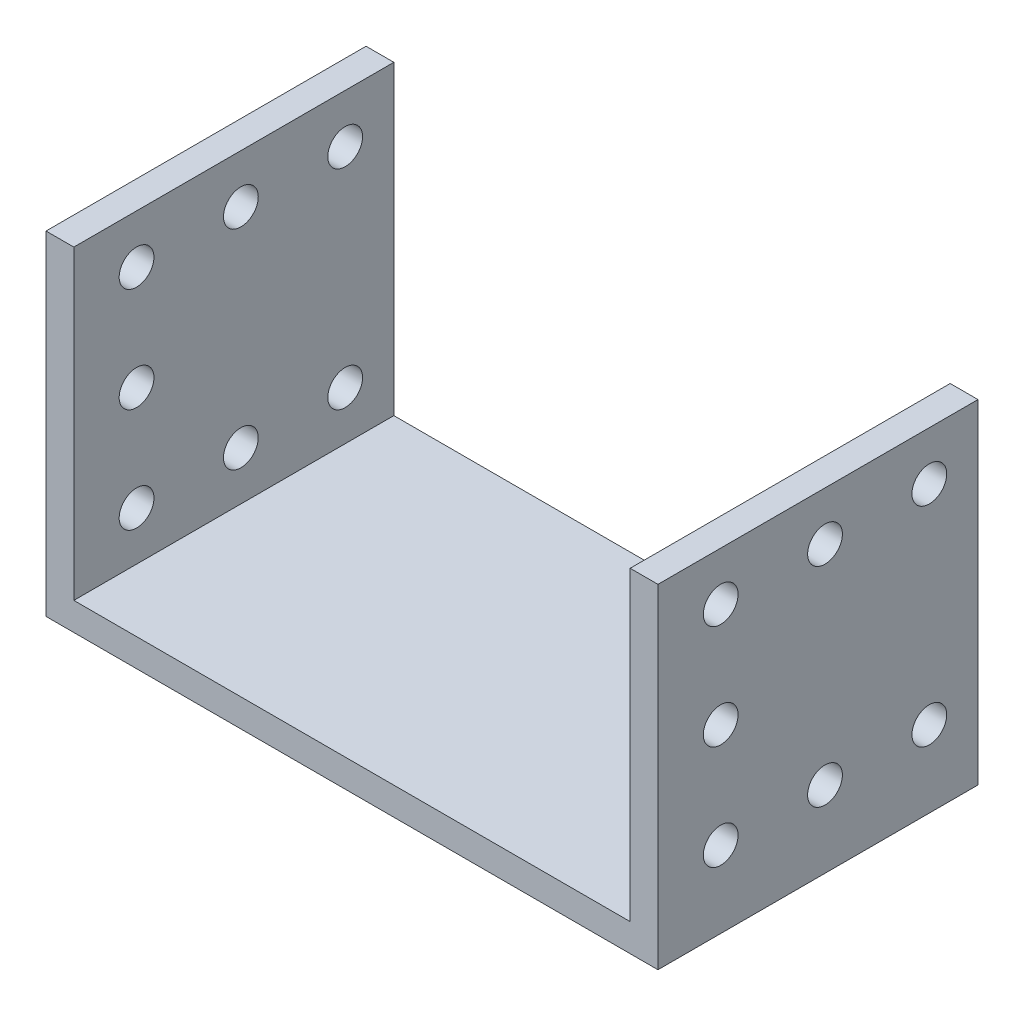
ISO-10303-21;
HEADER;
FILE_DESCRIPTION(('STEP AP214'),'2;1');
FILE_NAME('part.step','',(''),(''),'','','');
FILE_SCHEMA(('AUTOMOTIVE_DESIGN { 1 0 10303 214 1 1 1 1 }'));
ENDSEC;
DATA;
#1=APPLICATION_CONTEXT('core data for automotive mechanical design processes');
#2=APPLICATION_PROTOCOL_DEFINITION('international standard','automotive_design',2000,#1);
#3=PRODUCT_CONTEXT('',#1,'mechanical');
#4=PRODUCT('Part','Part','',(#3));
#5=PRODUCT_RELATED_PRODUCT_CATEGORY('part','',(#4));
#6=PRODUCT_DEFINITION_FORMATION('','',#4);
#7=PRODUCT_DEFINITION_CONTEXT('part definition',#1,'design');
#8=PRODUCT_DEFINITION('design','',#6,#7);
#9=PRODUCT_DEFINITION_SHAPE('','',#8);
#10=(LENGTH_UNIT() NAMED_UNIT(*) SI_UNIT(.MILLI.,.METRE.));
#11=(NAMED_UNIT(*) PLANE_ANGLE_UNIT() SI_UNIT($,.RADIAN.));
#12=(NAMED_UNIT(*) SI_UNIT($,.STERADIAN.) SOLID_ANGLE_UNIT());
#13=UNCERTAINTY_MEASURE_WITH_UNIT(LENGTH_MEASURE(1.E-05),#10,'distance_accuracy_value','');
#14=(GEOMETRIC_REPRESENTATION_CONTEXT(3) GLOBAL_UNCERTAINTY_ASSIGNED_CONTEXT((#13)) GLOBAL_UNIT_ASSIGNED_CONTEXT((#10,
#11,#12)) REPRESENTATION_CONTEXT('',''));
#15=CARTESIAN_POINT('',(0.,0.,0.));
#16=DIRECTION('',(0.,0.,1.));
#17=DIRECTION('',(1.,0.,0.));
#18=AXIS2_PLACEMENT_3D('',#15,#16,#17);
#19=CARTESIAN_POINT('',(22.,0.,32.));
#20=DIRECTION('',(-1.,0.,0.));
#21=DIRECTION('',(0.,0.,1.));
#22=AXIS2_PLACEMENT_3D('',#19,#20,#21);
#23=PLANE('',#22);
#24=CARTESIAN_POINT('',(22.,20.5,18.5));
#25=DIRECTION('',(1.,0.,0.));
#26=DIRECTION('',(0.,0.,-1.));
#27=AXIS2_PLACEMENT_3D('',#24,#25,#26);
#28=CIRCLE('',#27,1.25);
#29=CARTESIAN_POINT('',(22.,20.5,17.25));
#30=VERTEX_POINT('',#29);
#31=EDGE_CURVE('E282',#30,#30,#28,.T.);
#32=ORIENTED_EDGE('',*,*,#31,.F.);
#33=EDGE_LOOP('',(#32));
#34=FACE_BOUND('',#33,.T.);
#35=CARTESIAN_POINT('',(22.,20.5,11.));
#36=DIRECTION('',(1.,0.,0.));
#37=DIRECTION('',(0.,0.,-1.));
#38=AXIS2_PLACEMENT_3D('',#35,#36,#37);
#39=CIRCLE('',#38,1.25);
#40=CARTESIAN_POINT('',(22.,20.5,9.75));
#41=VERTEX_POINT('',#40);
#42=EDGE_CURVE('E274',#41,#41,#39,.T.);
#43=ORIENTED_EDGE('',*,*,#42,.F.);
#44=EDGE_LOOP('',(#43));
#45=FACE_BOUND('',#44,.T.);
#46=CARTESIAN_POINT('',(22.,13.,18.5));
#47=DIRECTION('',(1.,0.,0.));
#48=DIRECTION('',(0.,0.,-1.));
#49=AXIS2_PLACEMENT_3D('',#46,#47,#48);
#50=CIRCLE('',#49,1.25);
#51=CARTESIAN_POINT('',(22.,13.,17.25));
#52=VERTEX_POINT('',#51);
#53=EDGE_CURVE('E266',#52,#52,#50,.T.);
#54=ORIENTED_EDGE('',*,*,#53,.F.);
#55=EDGE_LOOP('',(#54));
#56=FACE_BOUND('',#55,.T.);
#57=CARTESIAN_POINT('',(22.,5.5,3.5));
#58=DIRECTION('',(1.,0.,0.));
#59=DIRECTION('',(0.,0.,1.));
#60=AXIS2_PLACEMENT_3D('',#57,#58,#59);
#61=CIRCLE('',#60,1.25);
#62=CARTESIAN_POINT('',(22.,5.5,4.75));
#63=VERTEX_POINT('',#62);
#64=EDGE_CURVE('E257',#63,#63,#61,.T.);
#65=ORIENTED_EDGE('',*,*,#64,.F.);
#66=EDGE_LOOP('',(#65));
#67=FACE_BOUND('',#66,.T.);
#68=CARTESIAN_POINT('',(22.,5.5,11.));
#69=DIRECTION('',(1.,0.,0.));
#70=DIRECTION('',(0.,0.,1.));
#71=AXIS2_PLACEMENT_3D('',#68,#69,#70);
#72=CIRCLE('',#71,1.25);
#73=CARTESIAN_POINT('',(22.,5.5,12.25));
#74=VERTEX_POINT('',#73);
#75=EDGE_CURVE('E297',#74,#74,#72,.T.);
#76=ORIENTED_EDGE('',*,*,#75,.F.);
#77=EDGE_LOOP('',(#76));
#78=FACE_BOUND('',#77,.T.);
#79=CARTESIAN_POINT('',(22.,5.5,18.5));
#80=DIRECTION('',(1.,0.,0.));
#81=DIRECTION('',(0.,0.,1.));
#82=AXIS2_PLACEMENT_3D('',#79,#80,#81);
#83=CIRCLE('',#82,1.25);
#84=CARTESIAN_POINT('',(22.,5.5,19.75));
#85=VERTEX_POINT('',#84);
#86=EDGE_CURVE('E289',#85,#85,#83,.T.);
#87=ORIENTED_EDGE('',*,*,#86,.F.);
#88=EDGE_LOOP('',(#87));
#89=FACE_BOUND('',#88,.T.);
#90=CARTESIAN_POINT('',(22.,20.5,3.5));
#91=DIRECTION('',(1.,0.,0.));
#92=DIRECTION('',(0.,0.,-1.));
#93=AXIS2_PLACEMENT_3D('',#90,#91,#92);
#94=CIRCLE('',#93,1.25);
#95=CARTESIAN_POINT('',(22.,20.5,2.25));
#96=VERTEX_POINT('',#95);
#97=EDGE_CURVE('E249',#96,#96,#94,.T.);
#98=ORIENTED_EDGE('',*,*,#97,.F.);
#99=EDGE_LOOP('',(#98));
#100=FACE_BOUND('',#99,.T.);
#101=DIRECTION('',(0.,0.,-1.));
#102=VECTOR('',#101,1.);
#103=CARTESIAN_POINT('',(22.,24.,32.));
#104=LINE('',#103,#102);
#105=CARTESIAN_POINT('',(22.,24.,23.0113341665337));
#106=VERTEX_POINT('',#105);
#107=CARTESIAN_POINT('',(22.,24.,0.));
#108=VERTEX_POINT('',#107);
#109=EDGE_CURVE('E11',#106,#108,#104,.T.);
#110=ORIENTED_EDGE('',*,*,#109,.F.);
#111=DIRECTION('',(0.,1.,0.));
#112=VECTOR('',#111,1.);
#113=CARTESIAN_POINT('',(22.,24.,23.0113341665337));
#114=LINE('',#113,#112);
#115=CARTESIAN_POINT('',(22.,0.,23.0113341665337));
#116=VERTEX_POINT('',#115);
#117=EDGE_CURVE('E122',#116,#106,#114,.T.);
#118=ORIENTED_EDGE('',*,*,#117,.F.);
#119=DIRECTION('',(0.,0.,-1.));
#120=VECTOR('',#119,1.);
#121=CARTESIAN_POINT('',(22.,0.,32.));
#122=LINE('',#121,#120);
#123=CARTESIAN_POINT('',(22.,0.,0.));
#124=VERTEX_POINT('',#123);
#125=EDGE_CURVE('E62',#116,#124,#122,.T.);
#126=ORIENTED_EDGE('',*,*,#125,.T.);
#127=DIRECTION('',(0.,1.,0.));
#128=VECTOR('',#127,1.);
#129=CARTESIAN_POINT('',(22.,0.,0.));
#130=LINE('',#129,#128);
#131=EDGE_CURVE('E163',#124,#108,#130,.T.);
#132=ORIENTED_EDGE('',*,*,#131,.T.);
#133=EDGE_LOOP('',(#110,#118,#126,#132));
#134=FACE_BOUND('',#133,.T.);
#135=ADVANCED_FACE('F39',(#34,#45,#56,#67,#78,#89,#100,#134),#23,.F.);
#136=CARTESIAN_POINT('',(22.,24.,32.));
#137=DIRECTION('',(0.,-1.,0.));
#138=DIRECTION('',(0.,0.,-1.));
#139=AXIS2_PLACEMENT_3D('',#136,#137,#138);
#140=PLANE('',#139);
#141=DIRECTION('',(0.,0.,-1.));
#142=VECTOR('',#141,1.);
#143=CARTESIAN_POINT('',(20.,24.,32.));
#144=LINE('',#143,#142);
#145=CARTESIAN_POINT('',(20.,24.,23.0113341665337));
#146=VERTEX_POINT('',#145);
#147=CARTESIAN_POINT('',(20.,24.,0.));
#148=VERTEX_POINT('',#147);
#149=EDGE_CURVE('E47',#146,#148,#144,.T.);
#150=ORIENTED_EDGE('',*,*,#149,.F.);
#151=DIRECTION('',(1.,0.,0.));
#152=VECTOR('',#151,1.);
#153=CARTESIAN_POINT('',(-22.,24.,23.0113341665337));
#154=LINE('',#153,#152);
#155=EDGE_CURVE('E111',#146,#106,#154,.T.);
#156=ORIENTED_EDGE('',*,*,#155,.T.);
#157=ORIENTED_EDGE('',*,*,#109,.T.);
#158=DIRECTION('',(-1.,0.,0.));
#159=VECTOR('',#158,1.);
#160=CARTESIAN_POINT('',(22.,24.,0.));
#161=LINE('',#160,#159);
#162=EDGE_CURVE('E157',#108,#148,#161,.T.);
#163=ORIENTED_EDGE('',*,*,#162,.T.);
#164=EDGE_LOOP('',(#150,#156,#157,#163));
#165=FACE_BOUND('',#164,.T.);
#166=ADVANCED_FACE('F158',(#165),#140,.F.);
#167=CARTESIAN_POINT('',(20.,24.,32.));
#168=DIRECTION('',(1.,0.,0.));
#169=DIRECTION('',(0.,1.,0.));
#170=AXIS2_PLACEMENT_3D('',#167,#168,#169);
#171=PLANE('',#170);
#172=CARTESIAN_POINT('',(20.,20.5,18.5));
#173=DIRECTION('',(1.,0.,0.));
#174=DIRECTION('',(0.,1.,0.));
#175=AXIS2_PLACEMENT_3D('',#172,#173,#174);
#176=CIRCLE('',#175,1.25);
#177=CARTESIAN_POINT('',(20.,21.75,18.5));
#178=VERTEX_POINT('',#177);
#179=EDGE_CURVE('E191',#178,#178,#176,.T.);
#180=ORIENTED_EDGE('',*,*,#179,.T.);
#181=EDGE_LOOP('',(#180));
#182=FACE_BOUND('',#181,.T.);
#183=CARTESIAN_POINT('',(20.,20.5,11.));
#184=DIRECTION('',(1.,0.,0.));
#185=DIRECTION('',(0.,1.,0.));
#186=AXIS2_PLACEMENT_3D('',#183,#184,#185);
#187=CIRCLE('',#186,1.25);
#188=CARTESIAN_POINT('',(20.,21.75,11.));
#189=VERTEX_POINT('',#188);
#190=EDGE_CURVE('E200',#189,#189,#187,.T.);
#191=ORIENTED_EDGE('',*,*,#190,.T.);
#192=EDGE_LOOP('',(#191));
#193=FACE_BOUND('',#192,.T.);
#194=CARTESIAN_POINT('',(20.,13.,18.5));
#195=DIRECTION('',(1.,0.,0.));
#196=DIRECTION('',(0.,1.,0.));
#197=AXIS2_PLACEMENT_3D('',#194,#195,#196);
#198=CIRCLE('',#197,1.25);
#199=CARTESIAN_POINT('',(20.,14.25,18.5));
#200=VERTEX_POINT('',#199);
#201=EDGE_CURVE('E208',#200,#200,#198,.T.);
#202=ORIENTED_EDGE('',*,*,#201,.T.);
#203=EDGE_LOOP('',(#202));
#204=FACE_BOUND('',#203,.T.);
#205=CARTESIAN_POINT('',(20.,5.5,3.5));
#206=DIRECTION('',(1.,0.,0.));
#207=DIRECTION('',(0.,1.,0.));
#208=AXIS2_PLACEMENT_3D('',#205,#206,#207);
#209=CIRCLE('',#208,1.25);
#210=CARTESIAN_POINT('',(20.,6.75,3.5));
#211=VERTEX_POINT('',#210);
#212=EDGE_CURVE('E216',#211,#211,#209,.T.);
#213=ORIENTED_EDGE('',*,*,#212,.T.);
#214=EDGE_LOOP('',(#213));
#215=FACE_BOUND('',#214,.T.);
#216=CARTESIAN_POINT('',(20.,5.5,11.));
#217=DIRECTION('',(1.,0.,0.));
#218=DIRECTION('',(0.,1.,0.));
#219=AXIS2_PLACEMENT_3D('',#216,#217,#218);
#220=CIRCLE('',#219,1.25);
#221=CARTESIAN_POINT('',(20.,6.75,11.));
#222=VERTEX_POINT('',#221);
#223=EDGE_CURVE('E224',#222,#222,#220,.T.);
#224=ORIENTED_EDGE('',*,*,#223,.T.);
#225=EDGE_LOOP('',(#224));
#226=FACE_BOUND('',#225,.T.);
#227=CARTESIAN_POINT('',(20.,5.5,18.5));
#228=DIRECTION('',(1.,0.,0.));
#229=DIRECTION('',(0.,1.,0.));
#230=AXIS2_PLACEMENT_3D('',#227,#228,#229);
#231=CIRCLE('',#230,1.25);
#232=CARTESIAN_POINT('',(20.,6.75,18.5));
#233=VERTEX_POINT('',#232);
#234=EDGE_CURVE('E232',#233,#233,#231,.T.);
#235=ORIENTED_EDGE('',*,*,#234,.T.);
#236=EDGE_LOOP('',(#235));
#237=FACE_BOUND('',#236,.T.);
#238=CARTESIAN_POINT('',(20.,20.5,3.5));
#239=DIRECTION('',(1.,0.,0.));
#240=DIRECTION('',(0.,1.,0.));
#241=AXIS2_PLACEMENT_3D('',#238,#239,#240);
#242=CIRCLE('',#241,1.25);
#243=CARTESIAN_POINT('',(20.,21.75,3.5));
#244=VERTEX_POINT('',#243);
#245=EDGE_CURVE('E240',#244,#244,#242,.T.);
#246=ORIENTED_EDGE('',*,*,#245,.T.);
#247=EDGE_LOOP('',(#246));
#248=FACE_BOUND('',#247,.T.);
#249=DIRECTION('',(0.,0.,-1.));
#250=VECTOR('',#249,1.);
#251=CARTESIAN_POINT('',(20.,2.,32.));
#252=LINE('',#251,#250);
#253=CARTESIAN_POINT('',(20.,2.,23.0113341665337));
#254=VERTEX_POINT('',#253);
#255=CARTESIAN_POINT('',(20.,2.,0.));
#256=VERTEX_POINT('',#255);
#257=EDGE_CURVE('E140',#254,#256,#252,.T.);
#258=ORIENTED_EDGE('',*,*,#257,.F.);
#259=DIRECTION('',(0.,1.,0.));
#260=VECTOR('',#259,1.);
#261=CARTESIAN_POINT('',(20.,24.,23.0113341665337));
#262=LINE('',#261,#260);
#263=EDGE_CURVE('E153',#254,#146,#262,.T.);
#264=ORIENTED_EDGE('',*,*,#263,.T.);
#265=ORIENTED_EDGE('',*,*,#149,.T.);
#266=DIRECTION('',(0.,-1.,0.));
#267=VECTOR('',#266,1.);
#268=CARTESIAN_POINT('',(20.,24.,0.));
#269=LINE('',#268,#267);
#270=EDGE_CURVE('E151',#148,#256,#269,.T.);
#271=ORIENTED_EDGE('',*,*,#270,.T.);
#272=EDGE_LOOP('',(#258,#264,#265,#271));
#273=FACE_BOUND('',#272,.T.);
#274=ADVANCED_FACE('F149',(#182,#193,#204,#215,#226,#237,#248,#273),#171,.F.);
#275=CARTESIAN_POINT('',(-20.,2.,32.));
#276=DIRECTION('',(0.,-1.,0.));
#277=DIRECTION('',(0.,0.,-1.));
#278=AXIS2_PLACEMENT_3D('',#275,#276,#277);
#279=PLANE('',#278);
#280=DIRECTION('',(0.,0.,-1.));
#281=VECTOR('',#280,1.);
#282=CARTESIAN_POINT('',(-20.,2.,32.));
#283=LINE('',#282,#281);
#284=CARTESIAN_POINT('',(-20.,2.,23.0113341665337));
#285=VERTEX_POINT('',#284);
#286=CARTESIAN_POINT('',(-20.,2.,0.));
#287=VERTEX_POINT('',#286);
#288=EDGE_CURVE('E133',#285,#287,#283,.T.);
#289=ORIENTED_EDGE('',*,*,#288,.F.);
#290=DIRECTION('',(1.,0.,0.));
#291=VECTOR('',#290,1.);
#292=CARTESIAN_POINT('',(-20.,2.,23.0113341665337));
#293=LINE('',#292,#291);
#294=EDGE_CURVE('E306',#285,#254,#293,.T.);
#295=ORIENTED_EDGE('',*,*,#294,.T.);
#296=ORIENTED_EDGE('',*,*,#257,.T.);
#297=DIRECTION('',(-1.,0.,0.));
#298=VECTOR('',#297,1.);
#299=CARTESIAN_POINT('',(-20.,2.,0.));
#300=LINE('',#299,#298);
#301=EDGE_CURVE('E168',#256,#287,#300,.T.);
#302=ORIENTED_EDGE('',*,*,#301,.T.);
#303=EDGE_LOOP('',(#289,#295,#296,#302));
#304=FACE_BOUND('',#303,.T.);
#305=ADVANCED_FACE('F345',(#304),#279,.F.);
#306=CARTESIAN_POINT('',(-20.,24.,32.));
#307=DIRECTION('',(-1.,0.,0.));
#308=DIRECTION('',(0.,-1.,0.));
#309=AXIS2_PLACEMENT_3D('',#306,#307,#308);
#310=PLANE('',#309);
#311=CARTESIAN_POINT('',(-20.,20.5,18.5));
#312=DIRECTION('',(-1.,0.,0.));
#313=DIRECTION('',(0.,-1.,0.));
#314=AXIS2_PLACEMENT_3D('',#311,#312,#313);
#315=CIRCLE('',#314,1.25);
#316=CARTESIAN_POINT('',(-20.,19.25,18.5));
#317=VERTEX_POINT('',#316);
#318=EDGE_CURVE('E194',#317,#317,#315,.T.);
#319=ORIENTED_EDGE('',*,*,#318,.T.);
#320=EDGE_LOOP('',(#319));
#321=FACE_BOUND('',#320,.T.);
#322=CARTESIAN_POINT('',(-20.,20.5,11.));
#323=DIRECTION('',(-1.,0.,0.));
#324=DIRECTION('',(0.,-1.,0.));
#325=AXIS2_PLACEMENT_3D('',#322,#323,#324);
#326=CIRCLE('',#325,1.25);
#327=CARTESIAN_POINT('',(-20.,19.25,11.));
#328=VERTEX_POINT('',#327);
#329=EDGE_CURVE('E204',#328,#328,#326,.T.);
#330=ORIENTED_EDGE('',*,*,#329,.T.);
#331=EDGE_LOOP('',(#330));
#332=FACE_BOUND('',#331,.T.);
#333=CARTESIAN_POINT('',(-20.,13.,18.5));
#334=DIRECTION('',(-1.,0.,0.));
#335=DIRECTION('',(0.,-1.,0.));
#336=AXIS2_PLACEMENT_3D('',#333,#334,#335);
#337=CIRCLE('',#336,1.25);
#338=CARTESIAN_POINT('',(-20.,11.75,18.5));
#339=VERTEX_POINT('',#338);
#340=EDGE_CURVE('E212',#339,#339,#337,.T.);
#341=ORIENTED_EDGE('',*,*,#340,.T.);
#342=EDGE_LOOP('',(#341));
#343=FACE_BOUND('',#342,.T.);
#344=CARTESIAN_POINT('',(-20.,5.5,3.5));
#345=DIRECTION('',(-1.,0.,0.));
#346=DIRECTION('',(0.,-1.,0.));
#347=AXIS2_PLACEMENT_3D('',#344,#345,#346);
#348=CIRCLE('',#347,1.25);
#349=CARTESIAN_POINT('',(-20.,4.25,3.5));
#350=VERTEX_POINT('',#349);
#351=EDGE_CURVE('E220',#350,#350,#348,.T.);
#352=ORIENTED_EDGE('',*,*,#351,.T.);
#353=EDGE_LOOP('',(#352));
#354=FACE_BOUND('',#353,.T.);
#355=CARTESIAN_POINT('',(-20.,5.5,11.));
#356=DIRECTION('',(-1.,0.,0.));
#357=DIRECTION('',(0.,-1.,0.));
#358=AXIS2_PLACEMENT_3D('',#355,#356,#357);
#359=CIRCLE('',#358,1.25);
#360=CARTESIAN_POINT('',(-20.,4.25,11.));
#361=VERTEX_POINT('',#360);
#362=EDGE_CURVE('E228',#361,#361,#359,.T.);
#363=ORIENTED_EDGE('',*,*,#362,.T.);
#364=EDGE_LOOP('',(#363));
#365=FACE_BOUND('',#364,.T.);
#366=CARTESIAN_POINT('',(-20.,5.5,18.5));
#367=DIRECTION('',(-1.,0.,0.));
#368=DIRECTION('',(0.,-1.,0.));
#369=AXIS2_PLACEMENT_3D('',#366,#367,#368);
#370=CIRCLE('',#369,1.25);
#371=CARTESIAN_POINT('',(-20.,4.25,18.5));
#372=VERTEX_POINT('',#371);
#373=EDGE_CURVE('E236',#372,#372,#370,.T.);
#374=ORIENTED_EDGE('',*,*,#373,.T.);
#375=EDGE_LOOP('',(#374));
#376=FACE_BOUND('',#375,.T.);
#377=CARTESIAN_POINT('',(-20.,20.5,3.5));
#378=DIRECTION('',(-1.,0.,0.));
#379=DIRECTION('',(0.,-1.,0.));
#380=AXIS2_PLACEMENT_3D('',#377,#378,#379);
#381=CIRCLE('',#380,1.25);
#382=CARTESIAN_POINT('',(-20.,19.25,3.5));
#383=VERTEX_POINT('',#382);
#384=EDGE_CURVE('E244',#383,#383,#381,.T.);
#385=ORIENTED_EDGE('',*,*,#384,.T.);
#386=EDGE_LOOP('',(#385));
#387=FACE_BOUND('',#386,.T.);
#388=DIRECTION('',(0.,0.,-1.));
#389=VECTOR('',#388,1.);
#390=CARTESIAN_POINT('',(-20.,24.,32.));
#391=LINE('',#390,#389);
#392=CARTESIAN_POINT('',(-20.,24.,23.0113341665337));
#393=VERTEX_POINT('',#392);
#394=CARTESIAN_POINT('',(-20.,24.,0.));
#395=VERTEX_POINT('',#394);
#396=EDGE_CURVE('E129',#393,#395,#391,.T.);
#397=ORIENTED_EDGE('',*,*,#396,.F.);
#398=DIRECTION('',(0.,-1.,0.));
#399=VECTOR('',#398,1.);
#400=CARTESIAN_POINT('',(-20.,24.,23.0113341665337));
#401=LINE('',#400,#399);
#402=EDGE_CURVE('E106',#393,#285,#401,.T.);
#403=ORIENTED_EDGE('',*,*,#402,.T.);
#404=ORIENTED_EDGE('',*,*,#288,.T.);
#405=DIRECTION('',(0.,1.,0.));
#406=VECTOR('',#405,1.);
#407=CARTESIAN_POINT('',(-20.,24.,0.));
#408=LINE('',#407,#406);
#409=EDGE_CURVE('E172',#287,#395,#408,.T.);
#410=ORIENTED_EDGE('',*,*,#409,.T.);
#411=EDGE_LOOP('',(#397,#403,#404,#410));
#412=FACE_BOUND('',#411,.T.);
#413=ADVANCED_FACE('F351',(#321,#332,#343,#354,#365,#376,#387,#412),#310,.F.);
#414=CARTESIAN_POINT('',(-22.,24.,32.));
#415=DIRECTION('',(0.,-1.,0.));
#416=DIRECTION('',(0.,0.,-1.));
#417=AXIS2_PLACEMENT_3D('',#414,#415,#416);
#418=PLANE('',#417);
#419=DIRECTION('',(0.,0.,-1.));
#420=VECTOR('',#419,1.);
#421=CARTESIAN_POINT('',(-22.,24.,32.));
#422=LINE('',#421,#420);
#423=CARTESIAN_POINT('',(-22.,24.,23.0113341665337));
#424=VERTEX_POINT('',#423);
#425=CARTESIAN_POINT('',(-22.,24.,0.));
#426=VERTEX_POINT('',#425);
#427=EDGE_CURVE('E117',#424,#426,#422,.T.);
#428=ORIENTED_EDGE('',*,*,#427,.F.);
#429=EDGE_CURVE('E103',#424,#393,#154,.T.);
#430=ORIENTED_EDGE('',*,*,#429,.T.);
#431=ORIENTED_EDGE('',*,*,#396,.T.);
#432=DIRECTION('',(-1.,0.,0.));
#433=VECTOR('',#432,1.);
#434=CARTESIAN_POINT('',(-22.,24.,0.));
#435=LINE('',#434,#433);
#436=EDGE_CURVE('E126',#395,#426,#435,.T.);
#437=ORIENTED_EDGE('',*,*,#436,.T.);
#438=EDGE_LOOP('',(#428,#430,#431,#437));
#439=FACE_BOUND('',#438,.T.);
#440=ADVANCED_FACE('F124',(#439),#418,.F.);
#441=CARTESIAN_POINT('',(-22.,0.,32.));
#442=DIRECTION('',(1.,0.,0.));
#443=DIRECTION('',(0.,0.,-1.));
#444=AXIS2_PLACEMENT_3D('',#441,#442,#443);
#445=PLANE('',#444);
#446=CARTESIAN_POINT('',(-22.,20.5,18.5));
#447=DIRECTION('',(1.,0.,0.));
#448=DIRECTION('',(0.,0.,-1.));
#449=AXIS2_PLACEMENT_3D('',#446,#447,#448);
#450=CIRCLE('',#449,1.25);
#451=CARTESIAN_POINT('',(-22.,20.5,17.25));
#452=VERTEX_POINT('',#451);
#453=EDGE_CURVE('E253',#452,#452,#450,.T.);
#454=ORIENTED_EDGE('',*,*,#453,.T.);
#455=EDGE_LOOP('',(#454));
#456=FACE_BOUND('',#455,.T.);
#457=CARTESIAN_POINT('',(-22.,20.5,11.));
#458=DIRECTION('',(1.,0.,0.));
#459=DIRECTION('',(0.,0.,-1.));
#460=AXIS2_PLACEMENT_3D('',#457,#458,#459);
#461=CIRCLE('',#460,1.25);
#462=CARTESIAN_POINT('',(-22.,20.5,9.75));
#463=VERTEX_POINT('',#462);
#464=EDGE_CURVE('E278',#463,#463,#461,.T.);
#465=ORIENTED_EDGE('',*,*,#464,.T.);
#466=EDGE_LOOP('',(#465));
#467=FACE_BOUND('',#466,.T.);
#468=CARTESIAN_POINT('',(-22.,13.,18.5));
#469=DIRECTION('',(1.,0.,0.));
#470=DIRECTION('',(0.,0.,-1.));
#471=AXIS2_PLACEMENT_3D('',#468,#469,#470);
#472=CIRCLE('',#471,1.25);
#473=CARTESIAN_POINT('',(-22.,13.,17.25));
#474=VERTEX_POINT('',#473);
#475=EDGE_CURVE('E270',#474,#474,#472,.T.);
#476=ORIENTED_EDGE('',*,*,#475,.T.);
#477=EDGE_LOOP('',(#476));
#478=FACE_BOUND('',#477,.T.);
#479=CARTESIAN_POINT('',(-22.,5.5,3.5));
#480=DIRECTION('',(1.,0.,0.));
#481=DIRECTION('',(0.,0.,1.));
#482=AXIS2_PLACEMENT_3D('',#479,#480,#481);
#483=CIRCLE('',#482,1.25);
#484=CARTESIAN_POINT('',(-22.,5.5,4.75));
#485=VERTEX_POINT('',#484);
#486=EDGE_CURVE('E261',#485,#485,#483,.T.);
#487=ORIENTED_EDGE('',*,*,#486,.T.);
#488=EDGE_LOOP('',(#487));
#489=FACE_BOUND('',#488,.T.);
#490=CARTESIAN_POINT('',(-22.,5.5,11.));
#491=DIRECTION('',(1.,0.,0.));
#492=DIRECTION('',(0.,0.,1.));
#493=AXIS2_PLACEMENT_3D('',#490,#491,#492);
#494=CIRCLE('',#493,1.25);
#495=CARTESIAN_POINT('',(-22.,5.5,12.25));
#496=VERTEX_POINT('',#495);
#497=EDGE_CURVE('E262',#496,#496,#494,.T.);
#498=ORIENTED_EDGE('',*,*,#497,.T.);
#499=EDGE_LOOP('',(#498));
#500=FACE_BOUND('',#499,.T.);
#501=CARTESIAN_POINT('',(-22.,5.5,18.5));
#502=DIRECTION('',(1.,0.,0.));
#503=DIRECTION('',(0.,0.,1.));
#504=AXIS2_PLACEMENT_3D('',#501,#502,#503);
#505=CIRCLE('',#504,1.25);
#506=CARTESIAN_POINT('',(-22.,5.5,19.75));
#507=VERTEX_POINT('',#506);
#508=EDGE_CURVE('E293',#507,#507,#505,.T.);
#509=ORIENTED_EDGE('',*,*,#508,.T.);
#510=EDGE_LOOP('',(#509));
#511=FACE_BOUND('',#510,.T.);
#512=CARTESIAN_POINT('',(-22.,20.5,3.5));
#513=DIRECTION('',(1.,0.,0.));
#514=DIRECTION('',(0.,0.,-1.));
#515=AXIS2_PLACEMENT_3D('',#512,#513,#514);
#516=CIRCLE('',#515,1.25);
#517=CARTESIAN_POINT('',(-22.,20.5,2.25));
#518=VERTEX_POINT('',#517);
#519=EDGE_CURVE('E248',#518,#518,#516,.T.);
#520=ORIENTED_EDGE('',*,*,#519,.T.);
#521=EDGE_LOOP('',(#520));
#522=FACE_BOUND('',#521,.T.);
#523=DIRECTION('',(0.,0.,-1.));
#524=VECTOR('',#523,1.);
#525=CARTESIAN_POINT('',(-22.,0.,32.));
#526=LINE('',#525,#524);
#527=CARTESIAN_POINT('',(-22.,0.,23.0113341665337));
#528=VERTEX_POINT('',#527);
#529=CARTESIAN_POINT('',(-22.,0.,0.));
#530=VERTEX_POINT('',#529);
#531=EDGE_CURVE('E119',#528,#530,#526,.T.);
#532=ORIENTED_EDGE('',*,*,#531,.F.);
#533=DIRECTION('',(0.,1.,0.));
#534=VECTOR('',#533,1.);
#535=CARTESIAN_POINT('',(-22.,24.,23.0113341665337));
#536=LINE('',#535,#534);
#537=EDGE_CURVE('E54',#528,#424,#536,.T.);
#538=ORIENTED_EDGE('',*,*,#537,.T.);
#539=ORIENTED_EDGE('',*,*,#427,.T.);
#540=DIRECTION('',(0.,-1.,0.));
#541=VECTOR('',#540,1.);
#542=CARTESIAN_POINT('',(-22.,0.,0.));
#543=LINE('',#542,#541);
#544=EDGE_CURVE('E181',#426,#530,#543,.T.);
#545=ORIENTED_EDGE('',*,*,#544,.T.);
#546=EDGE_LOOP('',(#532,#538,#539,#545));
#547=FACE_BOUND('',#546,.T.);
#548=ADVANCED_FACE('F115',(#456,#467,#478,#489,#500,#511,#522,#547),#445,.F.);
#549=CARTESIAN_POINT('',(-22.,0.,32.));
#550=DIRECTION('',(0.,1.,0.));
#551=DIRECTION('',(0.,0.,1.));
#552=AXIS2_PLACEMENT_3D('',#549,#550,#551);
#553=PLANE('',#552);
#554=ORIENTED_EDGE('',*,*,#125,.F.);
#555=DIRECTION('',(1.,0.,0.));
#556=VECTOR('',#555,1.);
#557=CARTESIAN_POINT('',(-22.,0.,23.0113341665337));
#558=LINE('',#557,#556);
#559=EDGE_CURVE('E121',#528,#116,#558,.T.);
#560=ORIENTED_EDGE('',*,*,#559,.F.);
#561=ORIENTED_EDGE('',*,*,#531,.T.);
#562=DIRECTION('',(1.,0.,0.));
#563=VECTOR('',#562,1.);
#564=CARTESIAN_POINT('',(-22.,0.,0.));
#565=LINE('',#564,#563);
#566=EDGE_CURVE('E184',#530,#124,#565,.T.);
#567=ORIENTED_EDGE('',*,*,#566,.T.);
#568=EDGE_LOOP('',(#554,#560,#561,#567));
#569=FACE_BOUND('',#568,.T.);
#570=ADVANCED_FACE('F189',(#569),#553,.F.);
#571=CARTESIAN_POINT('',(0.,0.,0.));
#572=DIRECTION('',(0.,0.,1.));
#573=DIRECTION('',(1.,0.,0.));
#574=AXIS2_PLACEMENT_3D('',#571,#572,#573);
#575=PLANE('',#574);
#576=ORIENTED_EDGE('',*,*,#131,.F.);
#577=ORIENTED_EDGE('',*,*,#566,.F.);
#578=ORIENTED_EDGE('',*,*,#544,.F.);
#579=ORIENTED_EDGE('',*,*,#436,.F.);
#580=ORIENTED_EDGE('',*,*,#409,.F.);
#581=ORIENTED_EDGE('',*,*,#301,.F.);
#582=ORIENTED_EDGE('',*,*,#270,.F.);
#583=ORIENTED_EDGE('',*,*,#162,.F.);
#584=EDGE_LOOP('',(#576,#577,#578,#579,#580,#581,#582,#583));
#585=FACE_BOUND('',#584,.T.);
#586=ADVANCED_FACE('F165',(#585),#575,.F.);
#587=CARTESIAN_POINT('',(-22.,20.5,3.5));
#588=DIRECTION('',(1.,0.,0.));
#589=DIRECTION('',(0.,0.,-1.));
#590=AXIS2_PLACEMENT_3D('',#587,#588,#589);
#591=CYLINDRICAL_SURFACE('',#590,1.25);
#592=ORIENTED_EDGE('',*,*,#519,.F.);
#593=EDGE_LOOP('',(#592));
#594=FACE_BOUND('',#593,.T.);
#595=ORIENTED_EDGE('',*,*,#384,.F.);
#596=EDGE_LOOP('',(#595));
#597=FACE_BOUND('',#596,.T.);
#598=ADVANCED_FACE('F341',(#594,#597),#591,.F.);
#599=CARTESIAN_POINT('',(-22.,5.5,18.5));
#600=DIRECTION('',(1.,0.,0.));
#601=DIRECTION('',(0.,0.,-1.));
#602=AXIS2_PLACEMENT_3D('',#599,#600,#601);
#603=CYLINDRICAL_SURFACE('',#602,1.25);
#604=ORIENTED_EDGE('',*,*,#508,.F.);
#605=EDGE_LOOP('',(#604));
#606=FACE_BOUND('',#605,.T.);
#607=ORIENTED_EDGE('',*,*,#373,.F.);
#608=EDGE_LOOP('',(#607));
#609=FACE_BOUND('',#608,.T.);
#610=ADVANCED_FACE('F391',(#606,#609),#603,.F.);
#611=CARTESIAN_POINT('',(-22.,5.5,11.));
#612=DIRECTION('',(1.,0.,0.));
#613=DIRECTION('',(0.,0.,-1.));
#614=AXIS2_PLACEMENT_3D('',#611,#612,#613);
#615=CYLINDRICAL_SURFACE('',#614,1.25);
#616=ORIENTED_EDGE('',*,*,#497,.F.);
#617=EDGE_LOOP('',(#616));
#618=FACE_BOUND('',#617,.T.);
#619=ORIENTED_EDGE('',*,*,#362,.F.);
#620=EDGE_LOOP('',(#619));
#621=FACE_BOUND('',#620,.T.);
#622=ADVANCED_FACE('F395',(#618,#621),#615,.F.);
#623=CARTESIAN_POINT('',(-22.,5.5,3.5));
#624=DIRECTION('',(1.,0.,0.));
#625=DIRECTION('',(0.,0.,-1.));
#626=AXIS2_PLACEMENT_3D('',#623,#624,#625);
#627=CYLINDRICAL_SURFACE('',#626,1.25);
#628=ORIENTED_EDGE('',*,*,#486,.F.);
#629=EDGE_LOOP('',(#628));
#630=FACE_BOUND('',#629,.T.);
#631=ORIENTED_EDGE('',*,*,#351,.F.);
#632=EDGE_LOOP('',(#631));
#633=FACE_BOUND('',#632,.T.);
#634=ADVANCED_FACE('F374',(#630,#633),#627,.F.);
#635=CARTESIAN_POINT('',(-22.,13.,18.5));
#636=DIRECTION('',(1.,0.,0.));
#637=DIRECTION('',(0.,0.,-1.));
#638=AXIS2_PLACEMENT_3D('',#635,#636,#637);
#639=CYLINDRICAL_SURFACE('',#638,1.25);
#640=ORIENTED_EDGE('',*,*,#475,.F.);
#641=EDGE_LOOP('',(#640));
#642=FACE_BOUND('',#641,.T.);
#643=ORIENTED_EDGE('',*,*,#340,.F.);
#644=EDGE_LOOP('',(#643));
#645=FACE_BOUND('',#644,.T.);
#646=ADVANCED_FACE('F379',(#642,#645),#639,.F.);
#647=CARTESIAN_POINT('',(-22.,20.5,11.));
#648=DIRECTION('',(1.,0.,0.));
#649=DIRECTION('',(0.,0.,-1.));
#650=AXIS2_PLACEMENT_3D('',#647,#648,#649);
#651=CYLINDRICAL_SURFACE('',#650,1.25);
#652=ORIENTED_EDGE('',*,*,#464,.F.);
#653=EDGE_LOOP('',(#652));
#654=FACE_BOUND('',#653,.T.);
#655=ORIENTED_EDGE('',*,*,#329,.F.);
#656=EDGE_LOOP('',(#655));
#657=FACE_BOUND('',#656,.T.);
#658=ADVANCED_FACE('F384',(#654,#657),#651,.F.);
#659=CARTESIAN_POINT('',(-22.,20.5,18.5));
#660=DIRECTION('',(1.,0.,0.));
#661=DIRECTION('',(0.,0.,-1.));
#662=AXIS2_PLACEMENT_3D('',#659,#660,#661);
#663=CYLINDRICAL_SURFACE('',#662,1.25);
#664=ORIENTED_EDGE('',*,*,#453,.F.);
#665=EDGE_LOOP('',(#664));
#666=FACE_BOUND('',#665,.T.);
#667=ORIENTED_EDGE('',*,*,#318,.F.);
#668=EDGE_LOOP('',(#667));
#669=FACE_BOUND('',#668,.T.);
#670=ADVANCED_FACE('F339',(#666,#669),#663,.F.);
#671=ORIENTED_EDGE('',*,*,#97,.T.);
#672=EDGE_LOOP('',(#671));
#673=FACE_BOUND('',#672,.T.);
#674=ORIENTED_EDGE('',*,*,#245,.F.);
#675=EDGE_LOOP('',(#674));
#676=FACE_BOUND('',#675,.T.);
#677=ADVANCED_FACE('F335',(#673,#676),#591,.F.);
#678=ORIENTED_EDGE('',*,*,#86,.T.);
#679=EDGE_LOOP('',(#678));
#680=FACE_BOUND('',#679,.T.);
#681=ORIENTED_EDGE('',*,*,#234,.F.);
#682=EDGE_LOOP('',(#681));
#683=FACE_BOUND('',#682,.T.);
#684=ADVANCED_FACE('F338',(#680,#683),#603,.F.);
#685=ORIENTED_EDGE('',*,*,#75,.T.);
#686=EDGE_LOOP('',(#685));
#687=FACE_BOUND('',#686,.T.);
#688=ORIENTED_EDGE('',*,*,#223,.F.);
#689=EDGE_LOOP('',(#688));
#690=FACE_BOUND('',#689,.T.);
#691=ADVANCED_FACE('F372',(#687,#690),#615,.F.);
#692=ORIENTED_EDGE('',*,*,#64,.T.);
#693=EDGE_LOOP('',(#692));
#694=FACE_BOUND('',#693,.T.);
#695=ORIENTED_EDGE('',*,*,#212,.F.);
#696=EDGE_LOOP('',(#695));
#697=FACE_BOUND('',#696,.T.);
#698=ADVANCED_FACE('F368',(#694,#697),#627,.F.);
#699=ORIENTED_EDGE('',*,*,#53,.T.);
#700=EDGE_LOOP('',(#699));
#701=FACE_BOUND('',#700,.T.);
#702=ORIENTED_EDGE('',*,*,#201,.F.);
#703=EDGE_LOOP('',(#702));
#704=FACE_BOUND('',#703,.T.);
#705=ADVANCED_FACE('F371',(#701,#704),#639,.F.);
#706=ORIENTED_EDGE('',*,*,#42,.T.);
#707=EDGE_LOOP('',(#706));
#708=FACE_BOUND('',#707,.T.);
#709=ORIENTED_EDGE('',*,*,#190,.F.);
#710=EDGE_LOOP('',(#709));
#711=FACE_BOUND('',#710,.T.);
#712=ADVANCED_FACE('F377',(#708,#711),#651,.F.);
#713=ORIENTED_EDGE('',*,*,#31,.T.);
#714=EDGE_LOOP('',(#713));
#715=FACE_BOUND('',#714,.T.);
#716=ORIENTED_EDGE('',*,*,#179,.F.);
#717=EDGE_LOOP('',(#716));
#718=FACE_BOUND('',#717,.T.);
#719=ADVANCED_FACE('F382',(#715,#718),#663,.F.);
#720=CARTESIAN_POINT('',(-22.,24.,23.0113341665337));
#721=DIRECTION('',(0.,0.,-1.));
#722=DIRECTION('',(-1.,0.,0.));
#723=AXIS2_PLACEMENT_3D('',#720,#721,#722);
#724=PLANE('',#723);
#725=ORIENTED_EDGE('',*,*,#294,.F.);
#726=ORIENTED_EDGE('',*,*,#402,.F.);
#727=ORIENTED_EDGE('',*,*,#429,.F.);
#728=ORIENTED_EDGE('',*,*,#537,.F.);
#729=ORIENTED_EDGE('',*,*,#559,.T.);
#730=ORIENTED_EDGE('',*,*,#117,.T.);
#731=ORIENTED_EDGE('',*,*,#155,.F.);
#732=ORIENTED_EDGE('',*,*,#263,.F.);
#733=EDGE_LOOP('',(#725,#726,#727,#728,#729,#730,#731,#732));
#734=FACE_BOUND('',#733,.T.);
#735=ADVANCED_FACE('F104',(#734),#724,.F.);
#736=CLOSED_SHELL('',(#135,#166,#274,#305,#413,#440,#548,#570,#586,#598,#610,#622,#634,#646,
#658,#670,#677,#684,#691,#698,#705,#712,#719,#735));
#737=MANIFOLD_SOLID_BREP('B2',#736);
#738=ADVANCED_BREP_SHAPE_REPRESENTATION('',(#18,#737),#14);
#739=SHAPE_DEFINITION_REPRESENTATION(#9,#738);
ENDSEC;
END-ISO-10303-21;
